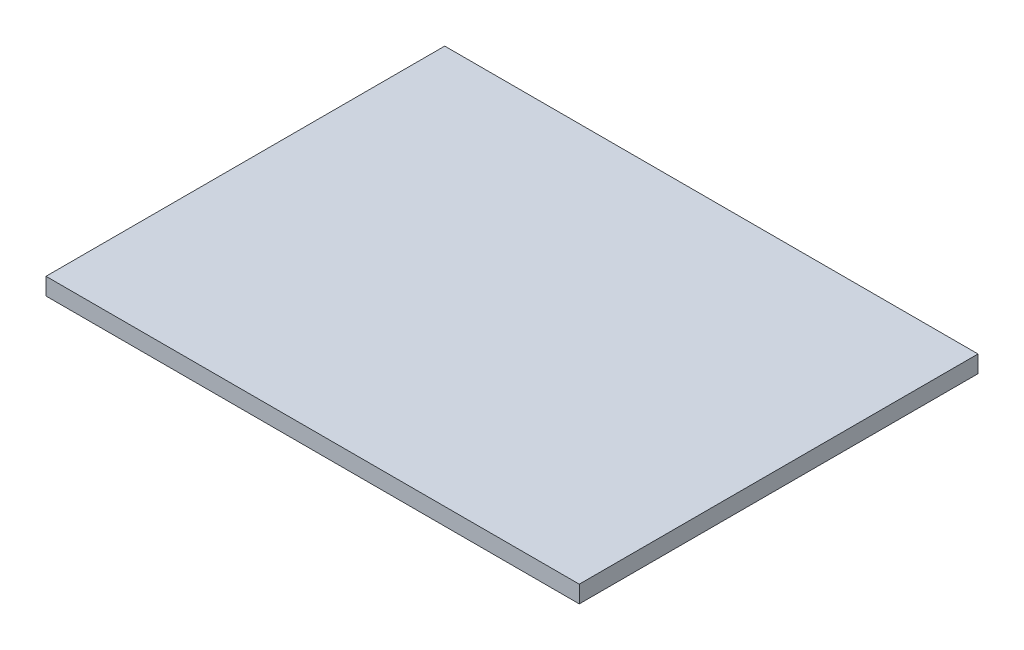
ISO-10303-21;
HEADER;
FILE_DESCRIPTION(('STEP AP214'),'2;1');
FILE_NAME('part.step','',(''),(''),'','','');
FILE_SCHEMA(('AUTOMOTIVE_DESIGN { 1 0 10303 214 1 1 1 1 }'));
ENDSEC;
DATA;
#1=APPLICATION_CONTEXT('core data for automotive mechanical design processes');
#2=APPLICATION_PROTOCOL_DEFINITION('international standard','automotive_design',2000,#1);
#3=PRODUCT_CONTEXT('',#1,'mechanical');
#4=PRODUCT('Part','Part','',(#3));
#5=PRODUCT_RELATED_PRODUCT_CATEGORY('part','',(#4));
#6=PRODUCT_DEFINITION_FORMATION('','',#4);
#7=PRODUCT_DEFINITION_CONTEXT('part definition',#1,'design');
#8=PRODUCT_DEFINITION('design','',#6,#7);
#9=PRODUCT_DEFINITION_SHAPE('','',#8);
#10=(LENGTH_UNIT() NAMED_UNIT(*) SI_UNIT(.MILLI.,.METRE.));
#11=(NAMED_UNIT(*) PLANE_ANGLE_UNIT() SI_UNIT($,.RADIAN.));
#12=(NAMED_UNIT(*) SI_UNIT($,.STERADIAN.) SOLID_ANGLE_UNIT());
#13=UNCERTAINTY_MEASURE_WITH_UNIT(LENGTH_MEASURE(1.E-05),#10,'distance_accuracy_value','');
#14=(GEOMETRIC_REPRESENTATION_CONTEXT(3) GLOBAL_UNCERTAINTY_ASSIGNED_CONTEXT((#13)) GLOBAL_UNIT_ASSIGNED_CONTEXT((#10,
#11,#12)) REPRESENTATION_CONTEXT('',''));
#15=CARTESIAN_POINT('',(0.,0.,0.));
#16=DIRECTION('',(0.,0.,1.));
#17=DIRECTION('',(1.,0.,0.));
#18=AXIS2_PLACEMENT_3D('',#15,#16,#17);
#19=CARTESIAN_POINT('',(109.,7.,-81.5));
#20=DIRECTION('',(-1.,0.,0.));
#21=DIRECTION('',(0.,0.,1.));
#22=AXIS2_PLACEMENT_3D('',#19,#20,#21);
#23=PLANE('',#22);
#24=DIRECTION('',(0.,0.,-1.));
#25=VECTOR('',#24,1.);
#26=CARTESIAN_POINT('',(109.,0.,-81.5));
#27=LINE('',#26,#25);
#28=CARTESIAN_POINT('',(109.,0.,81.5));
#29=VERTEX_POINT('',#28);
#30=CARTESIAN_POINT('',(109.,0.,-81.5));
#31=VERTEX_POINT('',#30);
#32=EDGE_CURVE('E96',#29,#31,#27,.T.);
#33=ORIENTED_EDGE('',*,*,#32,.T.);
#34=DIRECTION('',(0.,-1.,0.));
#35=VECTOR('',#34,1.);
#36=CARTESIAN_POINT('',(109.,7.,-81.5));
#37=LINE('',#36,#35);
#38=CARTESIAN_POINT('',(109.,7.,-81.5));
#39=VERTEX_POINT('',#38);
#40=EDGE_CURVE('E11',#39,#31,#37,.T.);
#41=ORIENTED_EDGE('',*,*,#40,.F.);
#42=DIRECTION('',(0.,0.,-1.));
#43=VECTOR('',#42,1.);
#44=CARTESIAN_POINT('',(109.,7.,-81.5));
#45=LINE('',#44,#43);
#46=CARTESIAN_POINT('',(109.,7.,81.5));
#47=VERTEX_POINT('',#46);
#48=EDGE_CURVE('E84',#47,#39,#45,.T.);
#49=ORIENTED_EDGE('',*,*,#48,.F.);
#50=DIRECTION('',(0.,-1.,0.));
#51=VECTOR('',#50,1.);
#52=CARTESIAN_POINT('',(109.,7.,81.5));
#53=LINE('',#52,#51);
#54=EDGE_CURVE('E92',#47,#29,#53,.T.);
#55=ORIENTED_EDGE('',*,*,#54,.T.);
#56=EDGE_LOOP('',(#33,#41,#49,#55));
#57=FACE_BOUND('',#56,.T.);
#58=ADVANCED_FACE('F33',(#57),#23,.F.);
#59=CARTESIAN_POINT('',(-109.,7.,-81.5));
#60=DIRECTION('',(0.,0.,1.));
#61=DIRECTION('',(1.,0.,0.));
#62=AXIS2_PLACEMENT_3D('',#59,#60,#61);
#63=PLANE('',#62);
#64=DIRECTION('',(-1.,0.,0.));
#65=VECTOR('',#64,1.);
#66=CARTESIAN_POINT('',(-109.,0.,-81.5));
#67=LINE('',#66,#65);
#68=CARTESIAN_POINT('',(-109.,0.,-81.5));
#69=VERTEX_POINT('',#68);
#70=EDGE_CURVE('E88',#31,#69,#67,.T.);
#71=ORIENTED_EDGE('',*,*,#70,.T.);
#72=DIRECTION('',(0.,-1.,0.));
#73=VECTOR('',#72,1.);
#74=CARTESIAN_POINT('',(-109.,7.,-81.5));
#75=LINE('',#74,#73);
#76=CARTESIAN_POINT('',(-109.,7.,-81.5));
#77=VERTEX_POINT('',#76);
#78=EDGE_CURVE('E41',#77,#69,#75,.T.);
#79=ORIENTED_EDGE('',*,*,#78,.F.);
#80=DIRECTION('',(-1.,0.,0.));
#81=VECTOR('',#80,1.);
#82=CARTESIAN_POINT('',(-109.,7.,-81.5));
#83=LINE('',#82,#81);
#84=EDGE_CURVE('E79',#39,#77,#83,.T.);
#85=ORIENTED_EDGE('',*,*,#84,.F.);
#86=ORIENTED_EDGE('',*,*,#40,.T.);
#87=EDGE_LOOP('',(#71,#79,#85,#86));
#88=FACE_BOUND('',#87,.T.);
#89=ADVANCED_FACE('F87',(#88),#63,.F.);
#90=CARTESIAN_POINT('',(-109.,7.,-81.5));
#91=DIRECTION('',(1.,0.,0.));
#92=DIRECTION('',(0.,0.,-1.));
#93=AXIS2_PLACEMENT_3D('',#90,#91,#92);
#94=PLANE('',#93);
#95=DIRECTION('',(0.,0.,1.));
#96=VECTOR('',#95,1.);
#97=CARTESIAN_POINT('',(-109.,0.,-81.5));
#98=LINE('',#97,#96);
#99=CARTESIAN_POINT('',(-109.,0.,81.5));
#100=VERTEX_POINT('',#99);
#101=EDGE_CURVE('E66',#69,#100,#98,.T.);
#102=ORIENTED_EDGE('',*,*,#101,.T.);
#103=DIRECTION('',(0.,-1.,0.));
#104=VECTOR('',#103,1.);
#105=CARTESIAN_POINT('',(-109.,7.,81.5));
#106=LINE('',#105,#104);
#107=CARTESIAN_POINT('',(-109.,7.,81.5));
#108=VERTEX_POINT('',#107);
#109=EDGE_CURVE('E89',#108,#100,#106,.T.);
#110=ORIENTED_EDGE('',*,*,#109,.F.);
#111=DIRECTION('',(0.,0.,1.));
#112=VECTOR('',#111,1.);
#113=CARTESIAN_POINT('',(-109.,7.,-81.5));
#114=LINE('',#113,#112);
#115=EDGE_CURVE('E82',#77,#108,#114,.T.);
#116=ORIENTED_EDGE('',*,*,#115,.F.);
#117=ORIENTED_EDGE('',*,*,#78,.T.);
#118=EDGE_LOOP('',(#102,#110,#116,#117));
#119=FACE_BOUND('',#118,.T.);
#120=ADVANCED_FACE('F90',(#119),#94,.F.);
#121=CARTESIAN_POINT('',(-109.,7.,81.5));
#122=DIRECTION('',(0.,0.,-1.));
#123=DIRECTION('',(-1.,0.,0.));
#124=AXIS2_PLACEMENT_3D('',#121,#122,#123);
#125=PLANE('',#124);
#126=DIRECTION('',(1.,0.,0.));
#127=VECTOR('',#126,1.);
#128=CARTESIAN_POINT('',(-109.,0.,81.5));
#129=LINE('',#128,#127);
#130=EDGE_CURVE('E72',#100,#29,#129,.T.);
#131=ORIENTED_EDGE('',*,*,#130,.T.);
#132=ORIENTED_EDGE('',*,*,#54,.F.);
#133=DIRECTION('',(1.,0.,0.));
#134=VECTOR('',#133,1.);
#135=CARTESIAN_POINT('',(-109.,7.,81.5));
#136=LINE('',#135,#134);
#137=EDGE_CURVE('E49',#108,#47,#136,.T.);
#138=ORIENTED_EDGE('',*,*,#137,.F.);
#139=ORIENTED_EDGE('',*,*,#109,.T.);
#140=EDGE_LOOP('',(#131,#132,#138,#139));
#141=FACE_BOUND('',#140,.T.);
#142=ADVANCED_FACE('F103',(#141),#125,.F.);
#143=CARTESIAN_POINT('',(0.,7.,0.));
#144=DIRECTION('',(0.,1.,0.));
#145=DIRECTION('',(0.,0.,1.));
#146=AXIS2_PLACEMENT_3D('',#143,#144,#145);
#147=PLANE('',#146);
#148=ORIENTED_EDGE('',*,*,#48,.T.);
#149=ORIENTED_EDGE('',*,*,#84,.T.);
#150=ORIENTED_EDGE('',*,*,#115,.T.);
#151=ORIENTED_EDGE('',*,*,#137,.T.);
#152=EDGE_LOOP('',(#148,#149,#150,#151));
#153=FACE_BOUND('',#152,.T.);
#154=ADVANCED_FACE('F80',(#153),#147,.T.);
#155=CARTESIAN_POINT('',(0.,0.,0.));
#156=DIRECTION('',(0.,1.,0.));
#157=DIRECTION('',(0.,0.,1.));
#158=AXIS2_PLACEMENT_3D('',#155,#156,#157);
#159=PLANE('',#158);
#160=ORIENTED_EDGE('',*,*,#32,.F.);
#161=ORIENTED_EDGE('',*,*,#130,.F.);
#162=ORIENTED_EDGE('',*,*,#101,.F.);
#163=ORIENTED_EDGE('',*,*,#70,.F.);
#164=EDGE_LOOP('',(#160,#161,#162,#163));
#165=FACE_BOUND('',#164,.T.);
#166=ADVANCED_FACE('F106',(#165),#159,.F.);
#167=CLOSED_SHELL('',(#58,#89,#120,#142,#154,#166));
#168=MANIFOLD_SOLID_BREP('B2',#167);
#169=ADVANCED_BREP_SHAPE_REPRESENTATION('',(#18,#168),#14);
#170=SHAPE_DEFINITION_REPRESENTATION(#9,#169);
ENDSEC;
END-ISO-10303-21;
